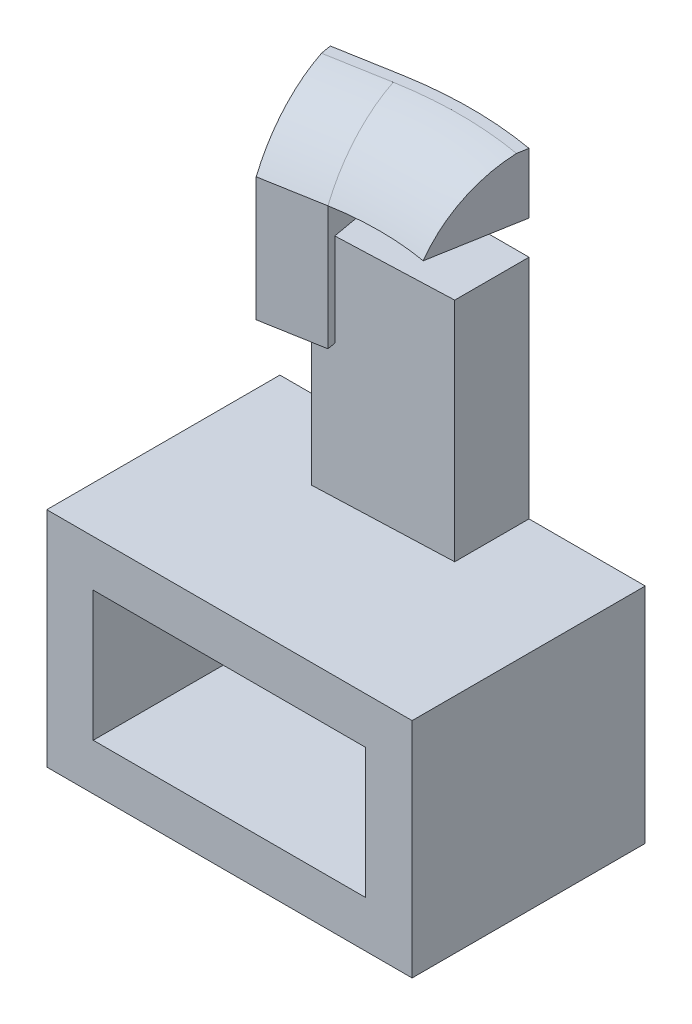
ISO-10303-21;
HEADER;
FILE_DESCRIPTION(('STEP AP214'),'2;1');
FILE_NAME('part.step','',(''),(''),'','','');
FILE_SCHEMA(('AUTOMOTIVE_DESIGN { 1 0 10303 214 1 1 1 1 }'));
ENDSEC;
DATA;
#1=APPLICATION_CONTEXT('core data for automotive mechanical design processes');
#2=APPLICATION_PROTOCOL_DEFINITION('international standard','automotive_design',2000,#1);
#3=PRODUCT_CONTEXT('',#1,'mechanical');
#4=PRODUCT('Part','Part','',(#3));
#5=PRODUCT_RELATED_PRODUCT_CATEGORY('part','',(#4));
#6=PRODUCT_DEFINITION_FORMATION('','',#4);
#7=PRODUCT_DEFINITION_CONTEXT('part definition',#1,'design');
#8=PRODUCT_DEFINITION('design','',#6,#7);
#9=PRODUCT_DEFINITION_SHAPE('','',#8);
#10=(LENGTH_UNIT() NAMED_UNIT(*) SI_UNIT(.MILLI.,.METRE.));
#11=(NAMED_UNIT(*) PLANE_ANGLE_UNIT() SI_UNIT($,.RADIAN.));
#12=(NAMED_UNIT(*) SI_UNIT($,.STERADIAN.) SOLID_ANGLE_UNIT());
#13=UNCERTAINTY_MEASURE_WITH_UNIT(LENGTH_MEASURE(1.E-05),#10,'distance_accuracy_value','');
#14=(GEOMETRIC_REPRESENTATION_CONTEXT(3) GLOBAL_UNCERTAINTY_ASSIGNED_CONTEXT((#13)) GLOBAL_UNIT_ASSIGNED_CONTEXT((#10,
#11,#12)) REPRESENTATION_CONTEXT('',''));
#15=CARTESIAN_POINT('',(0.,0.,0.));
#16=DIRECTION('',(0.,0.,1.));
#17=DIRECTION('',(1.,0.,0.));
#18=AXIS2_PLACEMENT_3D('',#15,#16,#17);
#19=CARTESIAN_POINT('',(-10.6977316429036,50.0739583710066,-7.9898509775484));
#20=DIRECTION('',(0.984807753012208,0.,-0.173648177666931));
#21=DIRECTION('',(-0.173648177666931,0.,-0.984807753012208));
#22=AXIS2_PLACEMENT_3D('',#19,#20,#21);
#23=PLANE('',#22);
#24=CARTESIAN_POINT('',(-10.7262728769476,49.8548084827866,-8.15171635929156));
#25=DIRECTION('',(-0.984807753012208,0.,0.173648177666931));
#26=DIRECTION('',(0.173648177666931,0.,0.984807753012208));
#27=AXIS2_PLACEMENT_3D('',#24,#25,#26);
#28=CIRCLE('',#27,20.);
#29=CARTESIAN_POINT('',(-7.69348251153337,59.6,9.04809250279412));
#30=VERTEX_POINT('',#29);
#31=CARTESIAN_POINT('',(-9.95090882120348,69.35,-3.75440828636466));
#32=VERTEX_POINT('',#31);
#33=EDGE_CURVE('E131',#30,#32,#28,.T.);
#34=ORIENTED_EDGE('',*,*,#33,.F.);
#35=CARTESIAN_POINT('',(-10.6977316429036,50.0739583710066,-7.9898509775484));
#36=DIRECTION('',(0.984807753012208,0.,-0.173648177666931));
#37=DIRECTION('',(-0.173648177666931,0.,-0.984807753012208));
#38=AXIS2_PLACEMENT_3D('',#35,#36,#37);
#39=CIRCLE('',#38,19.75);
#40=EDGE_CURVE('E137',#32,#30,#39,.T.);
#41=ORIENTED_EDGE('',*,*,#40,.F.);
#42=EDGE_LOOP('',(#34,#41));
#43=FACE_BOUND('',#42,.T.);
#44=ADVANCED_FACE('F47',(#43),#23,.F.);
#45=CARTESIAN_POINT('',(0.,146.671144667634,52.68));
#46=DIRECTION('',(0.,1.,0.));
#47=DIRECTION('',(0.,0.,1.));
#48=AXIS2_PLACEMENT_3D('',#45,#46,#47);
#49=CYLINDRICAL_SURFACE('',#48,59.055);
#50=CARTESIAN_POINT('',(0.,69.35,52.68));
#51=DIRECTION('',(0.,1.,0.));
#52=DIRECTION('',(0.,0.,1.));
#53=AXIS2_PLACEMENT_3D('',#50,#51,#52);
#54=CIRCLE('',#53,59.055);
#55=CARTESIAN_POINT('',(10.2547931321206,69.35,-5.47782185413595));
#56=VERTEX_POINT('',#55);
#57=CARTESIAN_POINT('',(-10.2547931321206,69.35,-5.47782185413595));
#58=VERTEX_POINT('',#57);
#59=EDGE_CURVE('E12',#56,#58,#54,.T.);
#60=ORIENTED_EDGE('',*,*,#59,.F.);
#61=DIRECTION('',(0.,1.,0.));
#62=VECTOR('',#61,1.);
#63=CARTESIAN_POINT('',(10.2547931321206,59.6,-5.47782185413595));
#64=LINE('',#63,#62);
#65=CARTESIAN_POINT('',(10.2547931321206,59.6,-5.47782185413595));
#66=VERTEX_POINT('',#65);
#67=EDGE_CURVE('E146',#66,#56,#64,.T.);
#68=ORIENTED_EDGE('',*,*,#67,.F.);
#69=CARTESIAN_POINT('',(0.,59.6,52.68));
#70=DIRECTION('',(0.,1.,0.));
#71=DIRECTION('',(0.,0.,1.));
#72=AXIS2_PLACEMENT_3D('',#69,#70,#71);
#73=CIRCLE('',#72,59.055);
#74=CARTESIAN_POINT('',(-10.2547931321206,59.6,-5.47782185413595));
#75=VERTEX_POINT('',#74);
#76=EDGE_CURVE('E62',#66,#75,#73,.T.);
#77=ORIENTED_EDGE('',*,*,#76,.T.);
#78=DIRECTION('',(0.,1.,0.));
#79=VECTOR('',#78,1.);
#80=CARTESIAN_POINT('',(-10.2547931321206,59.6,-5.47782185413595));
#81=LINE('',#80,#79);
#82=EDGE_CURVE('E135',#75,#58,#81,.T.);
#83=ORIENTED_EDGE('',*,*,#82,.T.);
#84=EDGE_LOOP('',(#60,#68,#77,#83));
#85=FACE_BOUND('',#84,.T.);
#86=ADVANCED_FACE('F205',(#85),#49,.T.);
#87=CARTESIAN_POINT('',(10.2547931321206,69.35,-5.47782185413595));
#88=DIRECTION('',(0.,-1.,0.));
#89=DIRECTION('',(0.,0.,-1.));
#90=AXIS2_PLACEMENT_3D('',#87,#88,#89);
#91=PLANE('',#90);
#92=CARTESIAN_POINT('',(0.,69.35,52.68));
#93=DIRECTION('',(0.,1.,0.));
#94=DIRECTION('',(0.,0.,1.));
#95=AXIS2_PLACEMENT_3D('',#92,#93,#94);
#96=CIRCLE('',#95,57.305);
#97=CARTESIAN_POINT('',(9.95090882120347,69.35,-3.75440828636459));
#98=VERTEX_POINT('',#97);
#99=EDGE_CURVE('E55',#98,#32,#96,.T.);
#100=ORIENTED_EDGE('',*,*,#99,.F.);
#101=DIRECTION('',(-0.173648177666931,0.,0.984807753012208));
#102=VECTOR('',#101,1.);
#103=CARTESIAN_POINT('',(10.2547931321206,69.35,-5.47782185413595));
#104=LINE('',#103,#102);
#105=EDGE_CURVE('E149',#56,#98,#104,.T.);
#106=ORIENTED_EDGE('',*,*,#105,.F.);
#107=ORIENTED_EDGE('',*,*,#59,.T.);
#108=DIRECTION('',(0.984807753012208,0.,-0.173648177666931));
#109=VECTOR('',#108,1.);
#110=CARTESIAN_POINT('',(-20.1028706622427,69.35,-3.74134007746665));
#111=LINE('',#110,#109);
#112=CARTESIAN_POINT('',(-20.1028706622427,69.35,-3.74134007746665));
#113=VERTEX_POINT('',#112);
#114=EDGE_CURVE('E116',#113,#58,#111,.T.);
#115=ORIENTED_EDGE('',*,*,#114,.F.);
#116=DIRECTION('',(-0.173648177666931,0.,-0.984807753012208));
#117=VECTOR('',#116,1.);
#118=CARTESIAN_POINT('',(-19.7989863513256,69.35,-2.01792650969535));
#119=LINE('',#118,#117);
#120=CARTESIAN_POINT('',(-19.7989863513256,69.35,-2.01792650969535));
#121=VERTEX_POINT('',#120);
#122=EDGE_CURVE('E122',#121,#113,#119,.T.);
#123=ORIENTED_EDGE('',*,*,#122,.F.);
#124=DIRECTION('',(0.984807753012208,0.,-0.173648177666931));
#125=VECTOR('',#124,1.);
#126=CARTESIAN_POINT('',(-19.7989863513256,69.35,-2.01792650969535));
#127=LINE('',#126,#125);
#128=EDGE_CURVE('E165',#121,#32,#127,.T.);
#129=ORIENTED_EDGE('',*,*,#128,.T.);
#130=EDGE_LOOP('',(#100,#106,#107,#115,#123,#129));
#131=FACE_BOUND('',#130,.T.);
#132=ADVANCED_FACE('F49',(#131),#91,.F.);
#133=CARTESIAN_POINT('',(0.,50.0739583710066,52.68));
#134=DIRECTION('',(0.,1.,0.));
#135=DIRECTION('',(0.,0.,1.));
#136=AXIS2_PLACEMENT_3D('',#133,#134,#135);
#137=TOROIDAL_SURFACE('',#136,61.605781221745,19.75);
#138=CARTESIAN_POINT('',(0.,59.6,52.68));
#139=DIRECTION('',(0.,1.,0.));
#140=DIRECTION('',(0.,0.,1.));
#141=AXIS2_PLACEMENT_3D('',#138,#139,#140);
#142=CIRCLE('',#141,44.305);
#143=CARTESIAN_POINT('',(7.69348251153336,59.6,9.04809250279412));
#144=VERTEX_POINT('',#143);
#145=EDGE_CURVE('E70',#144,#30,#142,.T.);
#146=ORIENTED_EDGE('',*,*,#145,.F.);
#147=CARTESIAN_POINT('',(10.6977316429036,50.0739583710066,-7.9898509775484));
#148=DIRECTION('',(0.984807753012208,0.,0.173648177666931));
#149=DIRECTION('',(0.173648177666931,0.,-0.984807753012208));
#150=AXIS2_PLACEMENT_3D('',#147,#148,#149);
#151=CIRCLE('',#150,19.75);
#152=EDGE_CURVE('E152',#98,#144,#151,.T.);
#153=ORIENTED_EDGE('',*,*,#152,.F.);
#154=ORIENTED_EDGE('',*,*,#99,.T.);
#155=ORIENTED_EDGE('',*,*,#40,.T.);
#156=EDGE_LOOP('',(#146,#153,#154,#155));
#157=FACE_BOUND('',#156,.T.);
#158=ADVANCED_FACE('F160',(#157),#137,.T.);
#159=CARTESIAN_POINT('',(10.2547931321206,59.6,-5.47782185413595));
#160=DIRECTION('',(0.,1.,0.));
#161=DIRECTION('',(0.,0.,1.));
#162=AXIS2_PLACEMENT_3D('',#159,#160,#161);
#163=PLANE('',#162);
#164=DIRECTION('',(0.173648177666931,0.,-0.984807753012208));
#165=VECTOR('',#164,1.);
#166=CARTESIAN_POINT('',(10.2547931321206,59.6,-5.47782185413595));
#167=LINE('',#166,#165);
#168=EDGE_CURVE('E154',#144,#66,#167,.T.);
#169=ORIENTED_EDGE('',*,*,#168,.F.);
#170=ORIENTED_EDGE('',*,*,#145,.T.);
#171=DIRECTION('',(-0.173648177666931,0.,-0.984807753012208));
#172=VECTOR('',#171,1.);
#173=CARTESIAN_POINT('',(-10.2547931321206,59.6,-5.47782185413595));
#174=LINE('',#173,#172);
#175=EDGE_CURVE('E144',#30,#75,#174,.T.);
#176=ORIENTED_EDGE('',*,*,#175,.T.);
#177=ORIENTED_EDGE('',*,*,#76,.F.);
#178=EDGE_LOOP('',(#169,#170,#176,#177));
#179=FACE_BOUND('',#178,.T.);
#180=ADVANCED_FACE('F214',(#179),#163,.F.);
#181=CARTESIAN_POINT('',(10.6977316429036,50.0739583710066,-7.9898509775484));
#182=DIRECTION('',(0.984807753012208,0.,0.173648177666931));
#183=DIRECTION('',(0.173648177666931,0.,-0.984807753012208));
#184=AXIS2_PLACEMENT_3D('',#181,#182,#183);
#185=PLANE('',#184);
#186=ORIENTED_EDGE('',*,*,#67,.T.);
#187=ORIENTED_EDGE('',*,*,#105,.T.);
#188=ORIENTED_EDGE('',*,*,#152,.T.);
#189=ORIENTED_EDGE('',*,*,#168,.T.);
#190=EDGE_LOOP('',(#186,#187,#188,#189));
#191=FACE_BOUND('',#190,.T.);
#192=ADVANCED_FACE('F202',(#191),#185,.T.);
#193=CARTESIAN_POINT('',(-20.1028706622427,59.6,-3.74134007746665));
#194=DIRECTION('',(0.173648177666931,0.,0.984807753012208));
#195=DIRECTION('',(0.984807753012208,0.,-0.173648177666931));
#196=AXIS2_PLACEMENT_3D('',#193,#194,#195);
#197=PLANE('',#196);
#198=ORIENTED_EDGE('',*,*,#82,.F.);
#199=DIRECTION('',(0.,-1.,0.));
#200=VECTOR('',#199,1.);
#201=CARTESIAN_POINT('',(-10.2547931321206,59.6,-5.47782185413596));
#202=LINE('',#201,#200);
#203=CARTESIAN_POINT('',(-10.2547931321206,39.6,-5.47782185413595));
#204=VERTEX_POINT('',#203);
#205=EDGE_CURVE('E189',#75,#204,#202,.T.);
#206=ORIENTED_EDGE('',*,*,#205,.T.);
#207=DIRECTION('',(0.984807753012208,0.,-0.173648177666931));
#208=VECTOR('',#207,1.);
#209=CARTESIAN_POINT('',(-20.1028706622427,39.6,-3.74134007746665));
#210=LINE('',#209,#208);
#211=CARTESIAN_POINT('',(-20.1028706622427,39.6,-3.74134007746665));
#212=VERTEX_POINT('',#211);
#213=EDGE_CURVE('E118',#212,#204,#210,.T.);
#214=ORIENTED_EDGE('',*,*,#213,.F.);
#215=DIRECTION('',(0.,-1.,0.));
#216=VECTOR('',#215,1.);
#217=CARTESIAN_POINT('',(-20.1028706622427,69.35,-3.74134007746665));
#218=LINE('',#217,#216);
#219=EDGE_CURVE('E111',#113,#212,#218,.T.);
#220=ORIENTED_EDGE('',*,*,#219,.F.);
#221=ORIENTED_EDGE('',*,*,#114,.T.);
#222=EDGE_LOOP('',(#198,#206,#214,#220,#221));
#223=FACE_BOUND('',#222,.T.);
#224=ADVANCED_FACE('F114',(#223),#197,.F.);
#225=CARTESIAN_POINT('',(-20.1028706622427,39.6,-3.74134007746665));
#226=DIRECTION('',(0.,1.,0.));
#227=DIRECTION('',(-1.,0.,0.));
#228=AXIS2_PLACEMENT_3D('',#225,#226,#227);
#229=PLANE('',#228);
#230=DIRECTION('',(0.173648177666931,0.,0.984807753012208));
#231=VECTOR('',#230,1.);
#232=CARTESIAN_POINT('',(-10.2547931321206,39.6,-5.47782185413595));
#233=LINE('',#232,#231);
#234=CARTESIAN_POINT('',(-7.69348251153337,39.6,9.04809250279412));
#235=VERTEX_POINT('',#234);
#236=EDGE_CURVE('E188',#204,#235,#233,.T.);
#237=ORIENTED_EDGE('',*,*,#236,.T.);
#238=DIRECTION('',(0.984807753012208,0.,-0.173648177666931));
#239=VECTOR('',#238,1.);
#240=CARTESIAN_POINT('',(-17.5415600416554,39.6,10.7845742794634));
#241=LINE('',#240,#239);
#242=CARTESIAN_POINT('',(-17.5415600416554,39.6,10.7845742794634));
#243=VERTEX_POINT('',#242);
#244=EDGE_CURVE('E139',#243,#235,#241,.T.);
#245=ORIENTED_EDGE('',*,*,#244,.F.);
#246=DIRECTION('',(0.173648177666931,0.,0.984807753012208));
#247=VECTOR('',#246,1.);
#248=CARTESIAN_POINT('',(-20.1028706622427,39.6,-3.74134007746665));
#249=LINE('',#248,#247);
#250=EDGE_CURVE('E121',#212,#243,#249,.T.);
#251=ORIENTED_EDGE('',*,*,#250,.F.);
#252=ORIENTED_EDGE('',*,*,#213,.T.);
#253=EDGE_LOOP('',(#237,#245,#251,#252));
#254=FACE_BOUND('',#253,.T.);
#255=ADVANCED_FACE('F194',(#254),#229,.F.);
#256=CARTESIAN_POINT('',(-17.5415600416554,39.6,10.7845742794634));
#257=DIRECTION('',(-0.173648177666931,0.,-0.984807753012208));
#258=DIRECTION('',(-0.984807753012208,0.,0.173648177666931));
#259=AXIS2_PLACEMENT_3D('',#256,#257,#258);
#260=PLANE('',#259);
#261=DIRECTION('',(0.,1.,0.));
#262=VECTOR('',#261,1.);
#263=CARTESIAN_POINT('',(-7.69348251153337,39.6,9.04809250279412));
#264=LINE('',#263,#262);
#265=EDGE_CURVE('E169',#235,#30,#264,.T.);
#266=ORIENTED_EDGE('',*,*,#265,.T.);
#267=DIRECTION('',(0.984807753012208,0.,-0.173648177666931));
#268=VECTOR('',#267,1.);
#269=CARTESIAN_POINT('',(-17.5415600416555,59.6,10.7845742794634));
#270=LINE('',#269,#268);
#271=CARTESIAN_POINT('',(-17.5415600416555,59.6,10.7845742794634));
#272=VERTEX_POINT('',#271);
#273=EDGE_CURVE('E167',#272,#30,#270,.T.);
#274=ORIENTED_EDGE('',*,*,#273,.F.);
#275=DIRECTION('',(0.,1.,0.));
#276=VECTOR('',#275,1.);
#277=CARTESIAN_POINT('',(-17.5415600416554,39.6,10.7845742794634));
#278=LINE('',#277,#276);
#279=EDGE_CURVE('E173',#243,#272,#278,.T.);
#280=ORIENTED_EDGE('',*,*,#279,.F.);
#281=ORIENTED_EDGE('',*,*,#244,.T.);
#282=EDGE_LOOP('',(#266,#274,#280,#281));
#283=FACE_BOUND('',#282,.T.);
#284=ADVANCED_FACE('F182',(#283),#260,.F.);
#285=CARTESIAN_POINT('',(-20.5743504070697,49.8548084827866,-6.41523458262225));
#286=DIRECTION('',(0.984807753012208,0.,-0.173648177666931));
#287=DIRECTION('',(-0.173648177666931,0.,-0.984807753012208));
#288=AXIS2_PLACEMENT_3D('',#285,#286,#287);
#289=CYLINDRICAL_SURFACE('',#288,20.);
#290=ORIENTED_EDGE('',*,*,#33,.T.);
#291=ORIENTED_EDGE('',*,*,#128,.F.);
#292=CARTESIAN_POINT('',(-20.5743504070697,49.8548084827866,-6.41523458262225));
#293=DIRECTION('',(-0.984807753012208,0.,0.173648177666931));
#294=DIRECTION('',(0.173648177666931,0.,0.984807753012208));
#295=AXIS2_PLACEMENT_3D('',#292,#293,#294);
#296=CIRCLE('',#295,20.);
#297=EDGE_CURVE('E127',#272,#121,#296,.T.);
#298=ORIENTED_EDGE('',*,*,#297,.F.);
#299=ORIENTED_EDGE('',*,*,#273,.T.);
#300=EDGE_LOOP('',(#290,#291,#298,#299));
#301=FACE_BOUND('',#300,.T.);
#302=ADVANCED_FACE('F164',(#301),#289,.T.);
#303=CARTESIAN_POINT('',(-20.5743504070697,49.8548084827866,-6.41523458262225));
#304=DIRECTION('',(-0.984807753012208,0.,0.173648177666931));
#305=DIRECTION('',(0.173648177666931,0.,0.984807753012208));
#306=AXIS2_PLACEMENT_3D('',#303,#304,#305);
#307=PLANE('',#306);
#308=ORIENTED_EDGE('',*,*,#122,.T.);
#309=ORIENTED_EDGE('',*,*,#219,.T.);
#310=ORIENTED_EDGE('',*,*,#250,.T.);
#311=ORIENTED_EDGE('',*,*,#279,.T.);
#312=ORIENTED_EDGE('',*,*,#297,.T.);
#313=EDGE_LOOP('',(#308,#309,#310,#311,#312));
#314=FACE_BOUND('',#313,.T.);
#315=ADVANCED_FACE('F125',(#314),#307,.T.);
#316=CARTESIAN_POINT('',(-10.7262728769476,49.8548084827866,-8.15171635929156));
#317=DIRECTION('',(-0.984807753012208,0.,0.173648177666931));
#318=DIRECTION('',(0.173648177666931,0.,0.984807753012208));
#319=AXIS2_PLACEMENT_3D('',#316,#317,#318);
#320=PLANE('',#319);
#321=ORIENTED_EDGE('',*,*,#175,.F.);
#322=ORIENTED_EDGE('',*,*,#265,.F.);
#323=ORIENTED_EDGE('',*,*,#236,.F.);
#324=ORIENTED_EDGE('',*,*,#205,.F.);
#325=EDGE_LOOP('',(#321,#322,#323,#324));
#326=FACE_BOUND('',#325,.T.);
#327=ADVANCED_FACE('F186',(#326),#320,.F.);
#328=CLOSED_SHELL('',(#44,#86,#132,#158,#180,#192,#224,#255,#284,#302,#315,#327));
#329=MANIFOLD_SOLID_BREP('B2',#328);
#330=CARTESIAN_POINT('',(29.5,18.,10.));
#331=DIRECTION('',(0.,-1.,0.));
#332=DIRECTION('',(1.,0.,0.));
#333=AXIS2_PLACEMENT_3D('',#330,#331,#332);
#334=PLANE('',#333);
#335=DIRECTION('',(0.,0.,-1.));
#336=VECTOR('',#335,1.);
#337=CARTESIAN_POINT('',(10.7314014755038,18.,-5.00000000000001));
#338=LINE('',#337,#336);
#339=CARTESIAN_POINT('',(10.7314014755038,18.,6.99999999999999));
#340=VERTEX_POINT('',#339);
#341=CARTESIAN_POINT('',(10.7314014755038,18.,-5.));
#342=VERTEX_POINT('',#341);
#343=EDGE_CURVE('E443',#340,#342,#338,.T.);
#344=ORIENTED_EDGE('',*,*,#343,.F.);
#345=DIRECTION('',(0.999284899965762,0.,-0.0378112245294619));
#346=VECTOR('',#345,1.);
#347=CARTESIAN_POINT('',(-11.5916002298544,18.,7.84466404894318));
#348=LINE('',#347,#346);
#349=CARTESIAN_POINT('',(-11.5916002298544,18.,7.84466404894318));
#350=VERTEX_POINT('',#349);
#351=EDGE_CURVE('E451',#350,#340,#348,.T.);
#352=ORIENTED_EDGE('',*,*,#351,.F.);
#353=DIRECTION('',(0.,0.,1.));
#354=VECTOR('',#353,1.);
#355=CARTESIAN_POINT('',(-11.5916002298544,18.,-5.));
#356=LINE('',#355,#354);
#357=CARTESIAN_POINT('',(-11.5916002298544,18.,-5.));
#358=VERTEX_POINT('',#357);
#359=EDGE_CURVE('E438',#358,#350,#356,.T.);
#360=ORIENTED_EDGE('',*,*,#359,.F.);
#361=DIRECTION('',(-1.,0.,0.));
#362=VECTOR('',#361,1.);
#363=CARTESIAN_POINT('',(0.,18.,-5.));
#364=LINE('',#363,#362);
#365=CARTESIAN_POINT('',(-29.5,18.,-5.));
#366=VERTEX_POINT('',#365);
#367=EDGE_CURVE('E475',#358,#366,#364,.T.);
#368=ORIENTED_EDGE('',*,*,#367,.T.);
#369=DIRECTION('',(0.,0.,-1.));
#370=VECTOR('',#369,1.);
#371=CARTESIAN_POINT('',(-29.5,18.,10.));
#372=LINE('',#371,#370);
#373=CARTESIAN_POINT('',(-29.5,18.,32.65));
#374=VERTEX_POINT('',#373);
#375=EDGE_CURVE('E399',#374,#366,#372,.T.);
#376=ORIENTED_EDGE('',*,*,#375,.F.);
#377=DIRECTION('',(1.,0.,0.));
#378=VECTOR('',#377,1.);
#379=CARTESIAN_POINT('',(0.,18.,32.65));
#380=LINE('',#379,#378);
#381=CARTESIAN_POINT('',(29.5,18.,32.65));
#382=VERTEX_POINT('',#381);
#383=EDGE_CURVE('E425',#374,#382,#380,.T.);
#384=ORIENTED_EDGE('',*,*,#383,.T.);
#385=DIRECTION('',(0.,0.,-1.));
#386=VECTOR('',#385,1.);
#387=CARTESIAN_POINT('',(29.5,18.,10.));
#388=LINE('',#387,#386);
#389=CARTESIAN_POINT('',(29.5,18.,-5.));
#390=VERTEX_POINT('',#389);
#391=EDGE_CURVE('E483',#382,#390,#388,.T.);
#392=ORIENTED_EDGE('',*,*,#391,.T.);
#393=EDGE_CURVE('E476',#390,#342,#364,.T.);
#394=ORIENTED_EDGE('',*,*,#393,.T.);
#395=EDGE_LOOP('',(#344,#352,#360,#368,#376,#384,#392,#394));
#396=FACE_BOUND('',#395,.T.);
#397=ADVANCED_FACE('F303',(#396),#334,.F.);
#398=CARTESIAN_POINT('',(-29.5,-18.,10.));
#399=DIRECTION('',(1.,0.,0.));
#400=DIRECTION('',(0.,1.,0.));
#401=AXIS2_PLACEMENT_3D('',#398,#399,#400);
#402=PLANE('',#401);
#403=DIRECTION('',(0.,1.,0.));
#404=VECTOR('',#403,1.);
#405=CARTESIAN_POINT('',(-29.5,0.,-5.));
#406=LINE('',#405,#404);
#407=CARTESIAN_POINT('',(-29.5,-18.,-5.));
#408=VERTEX_POINT('',#407);
#409=EDGE_CURVE('E466',#408,#366,#406,.T.);
#410=ORIENTED_EDGE('',*,*,#409,.F.);
#411=DIRECTION('',(0.,0.,-1.));
#412=VECTOR('',#411,1.);
#413=CARTESIAN_POINT('',(-29.5,-18.,10.));
#414=LINE('',#413,#412);
#415=CARTESIAN_POINT('',(-29.5,-18.,32.65));
#416=VERTEX_POINT('',#415);
#417=EDGE_CURVE('E45',#416,#408,#414,.T.);
#418=ORIENTED_EDGE('',*,*,#417,.F.);
#419=DIRECTION('',(0.,1.,0.));
#420=VECTOR('',#419,1.);
#421=CARTESIAN_POINT('',(-29.5,0.,32.65));
#422=LINE('',#421,#420);
#423=EDGE_CURVE('E422',#416,#374,#422,.T.);
#424=ORIENTED_EDGE('',*,*,#423,.T.);
#425=ORIENTED_EDGE('',*,*,#375,.T.);
#426=EDGE_LOOP('',(#410,#418,#424,#425));
#427=FACE_BOUND('',#426,.T.);
#428=ADVANCED_FACE('F305',(#427),#402,.F.);
#429=CARTESIAN_POINT('',(29.5,-18.,10.));
#430=DIRECTION('',(0.,1.,0.));
#431=DIRECTION('',(-1.,0.,0.));
#432=AXIS2_PLACEMENT_3D('',#429,#430,#431);
#433=PLANE('',#432);
#434=DIRECTION('',(-1.,0.,0.));
#435=VECTOR('',#434,1.);
#436=CARTESIAN_POINT('',(0.,-18.,-5.));
#437=LINE('',#436,#435);
#438=CARTESIAN_POINT('',(29.5,-18.,-5.));
#439=VERTEX_POINT('',#438);
#440=EDGE_CURVE('E469',#439,#408,#437,.T.);
#441=ORIENTED_EDGE('',*,*,#440,.F.);
#442=DIRECTION('',(0.,0.,-1.));
#443=VECTOR('',#442,1.);
#444=CARTESIAN_POINT('',(29.5,-18.,10.));
#445=LINE('',#444,#443);
#446=CARTESIAN_POINT('',(29.5,-18.,32.65));
#447=VERTEX_POINT('',#446);
#448=EDGE_CURVE('E311',#447,#439,#445,.T.);
#449=ORIENTED_EDGE('',*,*,#448,.F.);
#450=DIRECTION('',(-1.,0.,0.));
#451=VECTOR('',#450,1.);
#452=CARTESIAN_POINT('',(0.,-18.,32.65));
#453=LINE('',#452,#451);
#454=EDGE_CURVE('E419',#447,#416,#453,.T.);
#455=ORIENTED_EDGE('',*,*,#454,.T.);
#456=ORIENTED_EDGE('',*,*,#417,.T.);
#457=EDGE_LOOP('',(#441,#449,#455,#456));
#458=FACE_BOUND('',#457,.T.);
#459=ADVANCED_FACE('F492',(#458),#433,.F.);
#460=CARTESIAN_POINT('',(29.5,-18.,10.));
#461=DIRECTION('',(-1.,0.,0.));
#462=DIRECTION('',(0.,0.,1.));
#463=AXIS2_PLACEMENT_3D('',#460,#461,#462);
#464=PLANE('',#463);
#465=DIRECTION('',(0.,1.,0.));
#466=VECTOR('',#465,1.);
#467=CARTESIAN_POINT('',(29.5,0.,-5.));
#468=LINE('',#467,#466);
#469=EDGE_CURVE('E472',#439,#390,#468,.T.);
#470=ORIENTED_EDGE('',*,*,#469,.T.);
#471=ORIENTED_EDGE('',*,*,#391,.F.);
#472=DIRECTION('',(0.,-1.,0.));
#473=VECTOR('',#472,1.);
#474=CARTESIAN_POINT('',(29.5,0.,32.65));
#475=LINE('',#474,#473);
#476=EDGE_CURVE('E428',#382,#447,#475,.T.);
#477=ORIENTED_EDGE('',*,*,#476,.T.);
#478=ORIENTED_EDGE('',*,*,#448,.T.);
#479=EDGE_LOOP('',(#470,#471,#477,#478));
#480=FACE_BOUND('',#479,.T.);
#481=ADVANCED_FACE('F486',(#480),#464,.F.);
#482=CARTESIAN_POINT('',(0.,0.,-5.));
#483=DIRECTION('',(0.,0.,1.));
#484=DIRECTION('',(1.,0.,0.));
#485=AXIS2_PLACEMENT_3D('',#482,#483,#484);
#486=PLANE('',#485);
#487=ORIENTED_EDGE('',*,*,#409,.T.);
#488=ORIENTED_EDGE('',*,*,#367,.F.);
#489=DIRECTION('',(0.,-1.,0.));
#490=VECTOR('',#489,1.);
#491=CARTESIAN_POINT('',(-11.5916002298545,54.6,-5.));
#492=LINE('',#491,#490);
#493=CARTESIAN_POINT('',(-11.5916002298545,54.6,-5.));
#494=VERTEX_POINT('',#493);
#495=EDGE_CURVE('E463',#494,#358,#492,.T.);
#496=ORIENTED_EDGE('',*,*,#495,.F.);
#497=DIRECTION('',(-1.,0.,0.));
#498=VECTOR('',#497,1.);
#499=CARTESIAN_POINT('',(-11.5916002298545,54.6,-5.));
#500=LINE('',#499,#498);
#501=CARTESIAN_POINT('',(10.7314014755038,54.6,-5.00000000000001));
#502=VERTEX_POINT('',#501);
#503=EDGE_CURVE('E439',#502,#494,#500,.T.);
#504=ORIENTED_EDGE('',*,*,#503,.F.);
#505=DIRECTION('',(0.,-1.,0.));
#506=VECTOR('',#505,1.);
#507=CARTESIAN_POINT('',(10.7314014755038,54.6,-5.00000000000001));
#508=LINE('',#507,#506);
#509=EDGE_CURVE('E449',#502,#342,#508,.T.);
#510=ORIENTED_EDGE('',*,*,#509,.T.);
#511=ORIENTED_EDGE('',*,*,#393,.F.);
#512=ORIENTED_EDGE('',*,*,#469,.F.);
#513=ORIENTED_EDGE('',*,*,#440,.T.);
#514=EDGE_LOOP('',(#487,#488,#496,#504,#510,#511,#512,#513));
#515=FACE_BOUND('',#514,.T.);
#516=ADVANCED_FACE('F495',(#515),#486,.F.);
#517=CARTESIAN_POINT('',(-11.5916002298545,54.6,-5.));
#518=DIRECTION('',(1.,0.,0.));
#519=DIRECTION('',(0.,1.,0.));
#520=AXIS2_PLACEMENT_3D('',#517,#518,#519);
#521=PLANE('',#520);
#522=ORIENTED_EDGE('',*,*,#359,.T.);
#523=DIRECTION('',(0.,-1.,0.));
#524=VECTOR('',#523,1.);
#525=CARTESIAN_POINT('',(-11.5916002298545,54.6,7.84466404894318));
#526=LINE('',#525,#524);
#527=CARTESIAN_POINT('',(-11.5916002298545,54.6,7.84466404894318));
#528=VERTEX_POINT('',#527);
#529=EDGE_CURVE('E460',#528,#350,#526,.T.);
#530=ORIENTED_EDGE('',*,*,#529,.F.);
#531=DIRECTION('',(0.,0.,1.));
#532=VECTOR('',#531,1.);
#533=CARTESIAN_POINT('',(-11.5916002298545,54.6,-5.));
#534=LINE('',#533,#532);
#535=EDGE_CURVE('E442',#494,#528,#534,.T.);
#536=ORIENTED_EDGE('',*,*,#535,.F.);
#537=ORIENTED_EDGE('',*,*,#495,.T.);
#538=EDGE_LOOP('',(#522,#530,#536,#537));
#539=FACE_BOUND('',#538,.T.);
#540=ADVANCED_FACE('F513',(#539),#521,.F.);
#541=CARTESIAN_POINT('',(-11.5916002298545,54.6,7.84466404894318));
#542=DIRECTION('',(-0.0378112245294619,0.,-0.999284899965762));
#543=DIRECTION('',(-0.999284899965762,0.,0.0378112245294619));
#544=AXIS2_PLACEMENT_3D('',#541,#542,#543);
#545=PLANE('',#544);
#546=ORIENTED_EDGE('',*,*,#351,.T.);
#547=DIRECTION('',(0.,-1.,0.));
#548=VECTOR('',#547,1.);
#549=CARTESIAN_POINT('',(10.7314014755038,54.6,6.99999999999999));
#550=LINE('',#549,#548);
#551=CARTESIAN_POINT('',(10.7314014755038,54.6,6.99999999999999));
#552=VERTEX_POINT('',#551);
#553=EDGE_CURVE('E457',#552,#340,#550,.T.);
#554=ORIENTED_EDGE('',*,*,#553,.F.);
#555=DIRECTION('',(0.999284899965762,0.,-0.0378112245294619));
#556=VECTOR('',#555,1.);
#557=CARTESIAN_POINT('',(-11.5916002298545,54.6,7.84466404894318));
#558=LINE('',#557,#556);
#559=EDGE_CURVE('E445',#528,#552,#558,.T.);
#560=ORIENTED_EDGE('',*,*,#559,.F.);
#561=ORIENTED_EDGE('',*,*,#529,.T.);
#562=EDGE_LOOP('',(#546,#554,#560,#561));
#563=FACE_BOUND('',#562,.T.);
#564=ADVANCED_FACE('F507',(#563),#545,.F.);
#565=CARTESIAN_POINT('',(10.7314014755038,54.6,-5.00000000000001));
#566=DIRECTION('',(-1.,0.,0.));
#567=DIRECTION('',(0.,-1.,0.));
#568=AXIS2_PLACEMENT_3D('',#565,#566,#567);
#569=PLANE('',#568);
#570=ORIENTED_EDGE('',*,*,#343,.T.);
#571=ORIENTED_EDGE('',*,*,#509,.F.);
#572=DIRECTION('',(0.,0.,-1.));
#573=VECTOR('',#572,1.);
#574=CARTESIAN_POINT('',(10.7314014755038,54.6,-5.00000000000001));
#575=LINE('',#574,#573);
#576=EDGE_CURVE('E447',#552,#502,#575,.T.);
#577=ORIENTED_EDGE('',*,*,#576,.F.);
#578=ORIENTED_EDGE('',*,*,#553,.T.);
#579=EDGE_LOOP('',(#570,#571,#577,#578));
#580=FACE_BOUND('',#579,.T.);
#581=ADVANCED_FACE('F502',(#580),#569,.F.);
#582=CARTESIAN_POINT('',(0.,54.6,0.));
#583=DIRECTION('',(0.,-1.,0.));
#584=DIRECTION('',(1.,0.,0.));
#585=AXIS2_PLACEMENT_3D('',#582,#583,#584);
#586=PLANE('',#585);
#587=ORIENTED_EDGE('',*,*,#503,.T.);
#588=ORIENTED_EDGE('',*,*,#535,.T.);
#589=ORIENTED_EDGE('',*,*,#559,.T.);
#590=ORIENTED_EDGE('',*,*,#576,.T.);
#591=EDGE_LOOP('',(#587,#588,#589,#590));
#592=FACE_BOUND('',#591,.T.);
#593=ADVANCED_FACE('F515',(#592),#586,.F.);
#594=CARTESIAN_POINT('',(0.,0.,32.65));
#595=DIRECTION('',(0.,0.,-1.));
#596=DIRECTION('',(-1.,0.,0.));
#597=AXIS2_PLACEMENT_3D('',#594,#595,#596);
#598=PLANE('',#597);
#599=DIRECTION('',(0.,-1.,0.));
#600=VECTOR('',#599,1.);
#601=CARTESIAN_POINT('',(22.,0.,32.65));
#602=LINE('',#601,#600);
#603=CARTESIAN_POINT('',(22.,10.5,32.65));
#604=VERTEX_POINT('',#603);
#605=CARTESIAN_POINT('',(22.,-10.5,32.65));
#606=VERTEX_POINT('',#605);
#607=EDGE_CURVE('E414',#604,#606,#602,.T.);
#608=ORIENTED_EDGE('',*,*,#607,.T.);
#609=DIRECTION('',(-1.,0.,0.));
#610=VECTOR('',#609,1.);
#611=CARTESIAN_POINT('',(0.,-10.5,32.65));
#612=LINE('',#611,#610);
#613=CARTESIAN_POINT('',(-22.,-10.5,32.65));
#614=VERTEX_POINT('',#613);
#615=EDGE_CURVE('E394',#606,#614,#612,.T.);
#616=ORIENTED_EDGE('',*,*,#615,.T.);
#617=DIRECTION('',(0.,1.,0.));
#618=VECTOR('',#617,1.);
#619=CARTESIAN_POINT('',(-22.,0.,32.65));
#620=LINE('',#619,#618);
#621=CARTESIAN_POINT('',(-22.,10.5,32.65));
#622=VERTEX_POINT('',#621);
#623=EDGE_CURVE('E403',#614,#622,#620,.T.);
#624=ORIENTED_EDGE('',*,*,#623,.T.);
#625=DIRECTION('',(1.,0.,0.));
#626=VECTOR('',#625,1.);
#627=CARTESIAN_POINT('',(0.,10.5,32.65));
#628=LINE('',#627,#626);
#629=EDGE_CURVE('E409',#622,#604,#628,.T.);
#630=ORIENTED_EDGE('',*,*,#629,.T.);
#631=EDGE_LOOP('',(#608,#616,#624,#630));
#632=FACE_BOUND('',#631,.T.);
#633=ORIENTED_EDGE('',*,*,#454,.F.);
#634=ORIENTED_EDGE('',*,*,#476,.F.);
#635=ORIENTED_EDGE('',*,*,#383,.F.);
#636=ORIENTED_EDGE('',*,*,#423,.F.);
#637=EDGE_LOOP('',(#633,#634,#635,#636));
#638=FACE_BOUND('',#637,.T.);
#639=ADVANCED_FACE('F411',(#632,#638),#598,.F.);
#640=CARTESIAN_POINT('',(0.,0.,7.65));
#641=DIRECTION('',(0.,0.,1.));
#642=DIRECTION('',(1.,0.,0.));
#643=AXIS2_PLACEMENT_3D('',#640,#641,#642);
#644=PLANE('',#643);
#645=DIRECTION('',(0.,1.,0.));
#646=VECTOR('',#645,1.);
#647=CARTESIAN_POINT('',(-22.,0.,7.65));
#648=LINE('',#647,#646);
#649=CARTESIAN_POINT('',(-22.,-10.5,7.65));
#650=VERTEX_POINT('',#649);
#651=CARTESIAN_POINT('',(-22.,10.5,7.65));
#652=VERTEX_POINT('',#651);
#653=EDGE_CURVE('E431',#650,#652,#648,.T.);
#654=ORIENTED_EDGE('',*,*,#653,.F.);
#655=DIRECTION('',(-1.,0.,0.));
#656=VECTOR('',#655,1.);
#657=CARTESIAN_POINT('',(0.,-10.5,7.65));
#658=LINE('',#657,#656);
#659=CARTESIAN_POINT('',(22.,-10.5,7.65));
#660=VERTEX_POINT('',#659);
#661=EDGE_CURVE('E318',#660,#650,#658,.T.);
#662=ORIENTED_EDGE('',*,*,#661,.F.);
#663=DIRECTION('',(0.,1.,0.));
#664=VECTOR('',#663,1.);
#665=CARTESIAN_POINT('',(22.,0.,7.65));
#666=LINE('',#665,#664);
#667=CARTESIAN_POINT('',(22.,10.5,7.65));
#668=VERTEX_POINT('',#667);
#669=EDGE_CURVE('E326',#660,#668,#666,.T.);
#670=ORIENTED_EDGE('',*,*,#669,.T.);
#671=DIRECTION('',(-1.,0.,0.));
#672=VECTOR('',#671,1.);
#673=CARTESIAN_POINT('',(0.,10.5,7.65));
#674=LINE('',#673,#672);
#675=EDGE_CURVE('E435',#668,#652,#674,.T.);
#676=ORIENTED_EDGE('',*,*,#675,.T.);
#677=EDGE_LOOP('',(#654,#662,#670,#676));
#678=FACE_BOUND('',#677,.T.);
#679=ADVANCED_FACE('F522',(#678),#644,.T.);
#680=CARTESIAN_POINT('',(-22.,-10.5,10.));
#681=DIRECTION('',(1.,0.,0.));
#682=DIRECTION('',(0.,0.,-1.));
#683=AXIS2_PLACEMENT_3D('',#680,#681,#682);
#684=PLANE('',#683);
#685=ORIENTED_EDGE('',*,*,#653,.T.);
#686=DIRECTION('',(0.,0.,-1.));
#687=VECTOR('',#686,1.);
#688=CARTESIAN_POINT('',(-22.,10.5,10.));
#689=LINE('',#688,#687);
#690=EDGE_CURVE('E405',#622,#652,#689,.T.);
#691=ORIENTED_EDGE('',*,*,#690,.F.);
#692=ORIENTED_EDGE('',*,*,#623,.F.);
#693=DIRECTION('',(0.,0.,-1.));
#694=VECTOR('',#693,1.);
#695=CARTESIAN_POINT('',(-22.,-10.5,10.));
#696=LINE('',#695,#694);
#697=EDGE_CURVE('E390',#614,#650,#696,.T.);
#698=ORIENTED_EDGE('',*,*,#697,.T.);
#699=EDGE_LOOP('',(#685,#691,#692,#698));
#700=FACE_BOUND('',#699,.T.);
#701=ADVANCED_FACE('F404',(#700),#684,.T.);
#702=CARTESIAN_POINT('',(22.,10.5,10.));
#703=DIRECTION('',(0.,-1.,0.));
#704=DIRECTION('',(1.,0.,0.));
#705=AXIS2_PLACEMENT_3D('',#702,#703,#704);
#706=PLANE('',#705);
#707=ORIENTED_EDGE('',*,*,#675,.F.);
#708=DIRECTION('',(0.,0.,-1.));
#709=VECTOR('',#708,1.);
#710=CARTESIAN_POINT('',(22.,10.5,10.));
#711=LINE('',#710,#709);
#712=EDGE_CURVE('E479',#604,#668,#711,.T.);
#713=ORIENTED_EDGE('',*,*,#712,.F.);
#714=ORIENTED_EDGE('',*,*,#629,.F.);
#715=ORIENTED_EDGE('',*,*,#690,.T.);
#716=EDGE_LOOP('',(#707,#713,#714,#715));
#717=FACE_BOUND('',#716,.T.);
#718=ADVANCED_FACE('F622',(#717),#706,.T.);
#719=CARTESIAN_POINT('',(22.,-10.5,10.));
#720=DIRECTION('',(-1.,0.,0.));
#721=DIRECTION('',(0.,-1.,0.));
#722=AXIS2_PLACEMENT_3D('',#719,#720,#721);
#723=PLANE('',#722);
#724=ORIENTED_EDGE('',*,*,#669,.F.);
#725=DIRECTION('',(0.,0.,-1.));
#726=VECTOR('',#725,1.);
#727=CARTESIAN_POINT('',(22.,-10.5,10.));
#728=LINE('',#727,#726);
#729=EDGE_CURVE('E400',#606,#660,#728,.T.);
#730=ORIENTED_EDGE('',*,*,#729,.F.);
#731=ORIENTED_EDGE('',*,*,#607,.F.);
#732=ORIENTED_EDGE('',*,*,#712,.T.);
#733=EDGE_LOOP('',(#724,#730,#731,#732));
#734=FACE_BOUND('',#733,.T.);
#735=ADVANCED_FACE('F632',(#734),#723,.T.);
#736=CARTESIAN_POINT('',(22.,-10.5,10.));
#737=DIRECTION('',(0.,1.,0.));
#738=DIRECTION('',(-1.,0.,0.));
#739=AXIS2_PLACEMENT_3D('',#736,#737,#738);
#740=PLANE('',#739);
#741=ORIENTED_EDGE('',*,*,#661,.T.);
#742=ORIENTED_EDGE('',*,*,#697,.F.);
#743=ORIENTED_EDGE('',*,*,#615,.F.);
#744=ORIENTED_EDGE('',*,*,#729,.T.);
#745=EDGE_LOOP('',(#741,#742,#743,#744));
#746=FACE_BOUND('',#745,.T.);
#747=ADVANCED_FACE('F392',(#746),#740,.T.);
#748=CLOSED_SHELL('',(#397,#428,#459,#481,#516,#540,#564,#581,#593,#639,#679,#701,#718,#735,#747));
#749=MANIFOLD_SOLID_BREP('B6',#748);
#750=ADVANCED_BREP_SHAPE_REPRESENTATION('',(#18,#329,#749),#14);
#751=SHAPE_DEFINITION_REPRESENTATION(#9,#750);
ENDSEC;
END-ISO-10303-21;
